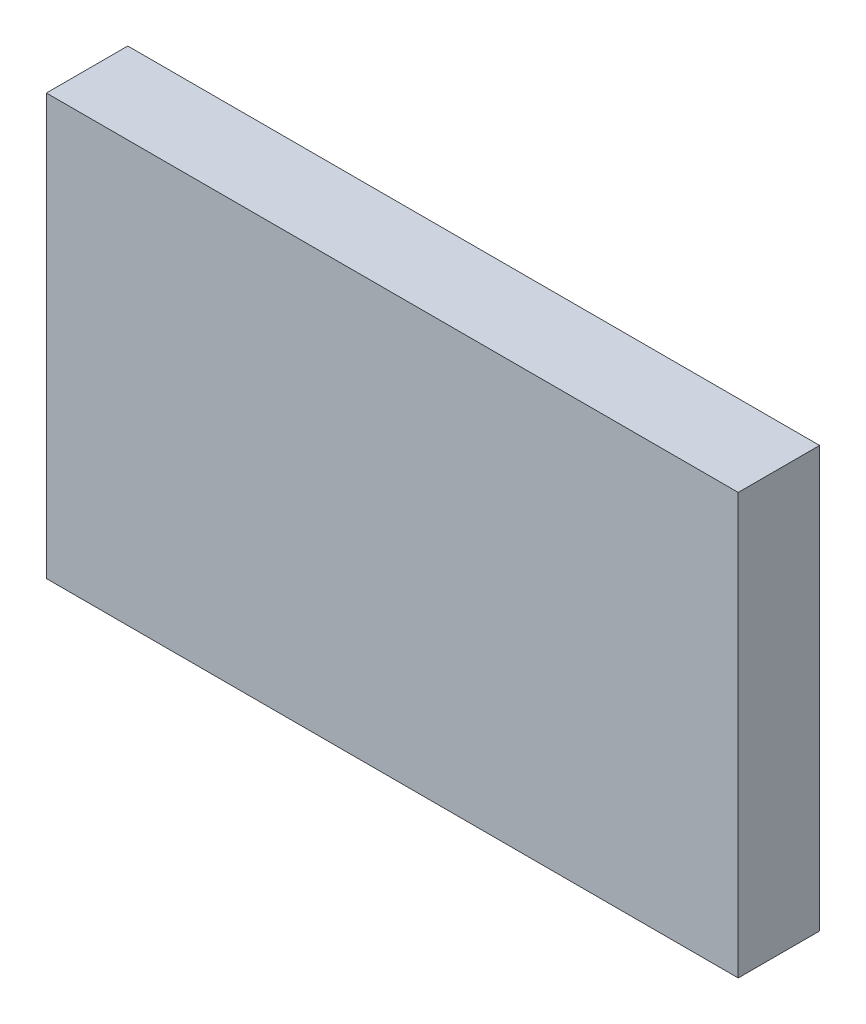
ISO-10303-21;
HEADER;
FILE_DESCRIPTION(('STEP AP214'),'2;1');
FILE_NAME('part.step','',(''),(''),'','','');
FILE_SCHEMA(('AUTOMOTIVE_DESIGN { 1 0 10303 214 1 1 1 1 }'));
ENDSEC;
DATA;
#1=APPLICATION_CONTEXT('core data for automotive mechanical design processes');
#2=APPLICATION_PROTOCOL_DEFINITION('international standard','automotive_design',2000,#1);
#3=PRODUCT_CONTEXT('',#1,'mechanical');
#4=PRODUCT('Part','Part','',(#3));
#5=PRODUCT_RELATED_PRODUCT_CATEGORY('part','',(#4));
#6=PRODUCT_DEFINITION_FORMATION('','',#4);
#7=PRODUCT_DEFINITION_CONTEXT('part definition',#1,'design');
#8=PRODUCT_DEFINITION('design','',#6,#7);
#9=PRODUCT_DEFINITION_SHAPE('','',#8);
#10=(LENGTH_UNIT() NAMED_UNIT(*) SI_UNIT(.MILLI.,.METRE.));
#11=(NAMED_UNIT(*) PLANE_ANGLE_UNIT() SI_UNIT($,.RADIAN.));
#12=(NAMED_UNIT(*) SI_UNIT($,.STERADIAN.) SOLID_ANGLE_UNIT());
#13=UNCERTAINTY_MEASURE_WITH_UNIT(LENGTH_MEASURE(1.E-05),#10,'distance_accuracy_value','');
#14=(GEOMETRIC_REPRESENTATION_CONTEXT(3) GLOBAL_UNCERTAINTY_ASSIGNED_CONTEXT((#13)) GLOBAL_UNIT_ASSIGNED_CONTEXT((#10,
#11,#12)) REPRESENTATION_CONTEXT('',''));
#15=CARTESIAN_POINT('',(0.,0.,0.));
#16=DIRECTION('',(0.,0.,1.));
#17=DIRECTION('',(1.,0.,0.));
#18=AXIS2_PLACEMENT_3D('',#15,#16,#17);
#19=CARTESIAN_POINT('',(0.,0.,12.));
#20=DIRECTION('',(1.,0.,0.));
#21=DIRECTION('',(0.,1.,0.));
#22=AXIS2_PLACEMENT_3D('',#19,#20,#21);
#23=PLANE('',#22);
#24=DIRECTION('',(0.,-1.,0.));
#25=VECTOR('',#24,1.);
#26=CARTESIAN_POINT('',(0.,0.,0.));
#27=LINE('',#26,#25);
#28=CARTESIAN_POINT('',(0.,0.,0.));
#29=VERTEX_POINT('',#28);
#30=CARTESIAN_POINT('',(0.,-62.,0.));
#31=VERTEX_POINT('',#30);
#32=EDGE_CURVE('E100',#29,#31,#27,.T.);
#33=ORIENTED_EDGE('',*,*,#32,.T.);
#34=DIRECTION('',(0.,0.,-1.));
#35=VECTOR('',#34,1.);
#36=CARTESIAN_POINT('',(0.,-62.,12.));
#37=LINE('',#36,#35);
#38=CARTESIAN_POINT('',(0.,-62.,12.));
#39=VERTEX_POINT('',#38);
#40=EDGE_CURVE('E11',#39,#31,#37,.T.);
#41=ORIENTED_EDGE('',*,*,#40,.F.);
#42=DIRECTION('',(0.,-1.,0.));
#43=VECTOR('',#42,1.);
#44=CARTESIAN_POINT('',(0.,0.,12.));
#45=LINE('',#44,#43);
#46=CARTESIAN_POINT('',(0.,0.,12.));
#47=VERTEX_POINT('',#46);
#48=EDGE_CURVE('E88',#47,#39,#45,.T.);
#49=ORIENTED_EDGE('',*,*,#48,.F.);
#50=DIRECTION('',(0.,0.,-1.));
#51=VECTOR('',#50,1.);
#52=CARTESIAN_POINT('',(0.,0.,12.));
#53=LINE('',#52,#51);
#54=EDGE_CURVE('E96',#47,#29,#53,.T.);
#55=ORIENTED_EDGE('',*,*,#54,.T.);
#56=EDGE_LOOP('',(#33,#41,#49,#55));
#57=FACE_BOUND('',#56,.T.);
#58=ADVANCED_FACE('F37',(#57),#23,.F.);
#59=CARTESIAN_POINT('',(0.,-62.,12.));
#60=DIRECTION('',(0.,1.,0.));
#61=DIRECTION('',(0.,0.,1.));
#62=AXIS2_PLACEMENT_3D('',#59,#60,#61);
#63=PLANE('',#62);
#64=DIRECTION('',(1.,0.,0.));
#65=VECTOR('',#64,1.);
#66=CARTESIAN_POINT('',(0.,-62.,0.));
#67=LINE('',#66,#65);
#68=CARTESIAN_POINT('',(102.,-62.,0.));
#69=VERTEX_POINT('',#68);
#70=EDGE_CURVE('E92',#31,#69,#67,.T.);
#71=ORIENTED_EDGE('',*,*,#70,.T.);
#72=DIRECTION('',(0.,0.,-1.));
#73=VECTOR('',#72,1.);
#74=CARTESIAN_POINT('',(102.,-62.,12.));
#75=LINE('',#74,#73);
#76=CARTESIAN_POINT('',(102.,-62.,12.));
#77=VERTEX_POINT('',#76);
#78=EDGE_CURVE('E45',#77,#69,#75,.T.);
#79=ORIENTED_EDGE('',*,*,#78,.F.);
#80=DIRECTION('',(1.,0.,0.));
#81=VECTOR('',#80,1.);
#82=CARTESIAN_POINT('',(0.,-62.,12.));
#83=LINE('',#82,#81);
#84=EDGE_CURVE('E83',#39,#77,#83,.T.);
#85=ORIENTED_EDGE('',*,*,#84,.F.);
#86=ORIENTED_EDGE('',*,*,#40,.T.);
#87=EDGE_LOOP('',(#71,#79,#85,#86));
#88=FACE_BOUND('',#87,.T.);
#89=ADVANCED_FACE('F91',(#88),#63,.F.);
#90=CARTESIAN_POINT('',(102.,0.,12.));
#91=DIRECTION('',(-1.,0.,0.));
#92=DIRECTION('',(0.,-1.,0.));
#93=AXIS2_PLACEMENT_3D('',#90,#91,#92);
#94=PLANE('',#93);
#95=DIRECTION('',(0.,1.,0.));
#96=VECTOR('',#95,1.);
#97=CARTESIAN_POINT('',(102.,0.,0.));
#98=LINE('',#97,#96);
#99=CARTESIAN_POINT('',(102.,0.,0.));
#100=VERTEX_POINT('',#99);
#101=EDGE_CURVE('E70',#69,#100,#98,.T.);
#102=ORIENTED_EDGE('',*,*,#101,.T.);
#103=DIRECTION('',(0.,0.,-1.));
#104=VECTOR('',#103,1.);
#105=CARTESIAN_POINT('',(102.,0.,12.));
#106=LINE('',#105,#104);
#107=CARTESIAN_POINT('',(102.,0.,12.));
#108=VERTEX_POINT('',#107);
#109=EDGE_CURVE('E93',#108,#100,#106,.T.);
#110=ORIENTED_EDGE('',*,*,#109,.F.);
#111=DIRECTION('',(0.,1.,0.));
#112=VECTOR('',#111,1.);
#113=CARTESIAN_POINT('',(102.,0.,12.));
#114=LINE('',#113,#112);
#115=EDGE_CURVE('E86',#77,#108,#114,.T.);
#116=ORIENTED_EDGE('',*,*,#115,.F.);
#117=ORIENTED_EDGE('',*,*,#78,.T.);
#118=EDGE_LOOP('',(#102,#110,#116,#117));
#119=FACE_BOUND('',#118,.T.);
#120=ADVANCED_FACE('F94',(#119),#94,.F.);
#121=CARTESIAN_POINT('',(0.,0.,12.));
#122=DIRECTION('',(0.,-1.,0.));
#123=DIRECTION('',(0.,0.,-1.));
#124=AXIS2_PLACEMENT_3D('',#121,#122,#123);
#125=PLANE('',#124);
#126=DIRECTION('',(-1.,0.,0.));
#127=VECTOR('',#126,1.);
#128=CARTESIAN_POINT('',(0.,0.,0.));
#129=LINE('',#128,#127);
#130=EDGE_CURVE('E76',#100,#29,#129,.T.);
#131=ORIENTED_EDGE('',*,*,#130,.T.);
#132=ORIENTED_EDGE('',*,*,#54,.F.);
#133=DIRECTION('',(-1.,0.,0.));
#134=VECTOR('',#133,1.);
#135=CARTESIAN_POINT('',(0.,0.,12.));
#136=LINE('',#135,#134);
#137=EDGE_CURVE('E53',#108,#47,#136,.T.);
#138=ORIENTED_EDGE('',*,*,#137,.F.);
#139=ORIENTED_EDGE('',*,*,#109,.T.);
#140=EDGE_LOOP('',(#131,#132,#138,#139));
#141=FACE_BOUND('',#140,.T.);
#142=ADVANCED_FACE('F107',(#141),#125,.F.);
#143=CARTESIAN_POINT('',(0.,0.,12.));
#144=DIRECTION('',(0.,0.,1.));
#145=DIRECTION('',(1.,0.,0.));
#146=AXIS2_PLACEMENT_3D('',#143,#144,#145);
#147=PLANE('',#146);
#148=ORIENTED_EDGE('',*,*,#48,.T.);
#149=ORIENTED_EDGE('',*,*,#84,.T.);
#150=ORIENTED_EDGE('',*,*,#115,.T.);
#151=ORIENTED_EDGE('',*,*,#137,.T.);
#152=EDGE_LOOP('',(#148,#149,#150,#151));
#153=FACE_BOUND('',#152,.T.);
#154=ADVANCED_FACE('F84',(#153),#147,.T.);
#155=CARTESIAN_POINT('',(0.,0.,0.));
#156=DIRECTION('',(0.,0.,1.));
#157=DIRECTION('',(1.,0.,0.));
#158=AXIS2_PLACEMENT_3D('',#155,#156,#157);
#159=PLANE('',#158);
#160=ORIENTED_EDGE('',*,*,#32,.F.);
#161=ORIENTED_EDGE('',*,*,#130,.F.);
#162=ORIENTED_EDGE('',*,*,#101,.F.);
#163=ORIENTED_EDGE('',*,*,#70,.F.);
#164=EDGE_LOOP('',(#160,#161,#162,#163));
#165=FACE_BOUND('',#164,.T.);
#166=ADVANCED_FACE('F110',(#165),#159,.F.);
#167=CLOSED_SHELL('',(#58,#89,#120,#142,#154,#166));
#168=MANIFOLD_SOLID_BREP('B2',#167);
#169=ADVANCED_BREP_SHAPE_REPRESENTATION('',(#18,#168),#14);
#170=SHAPE_DEFINITION_REPRESENTATION(#9,#169);
ENDSEC;
END-ISO-10303-21;
